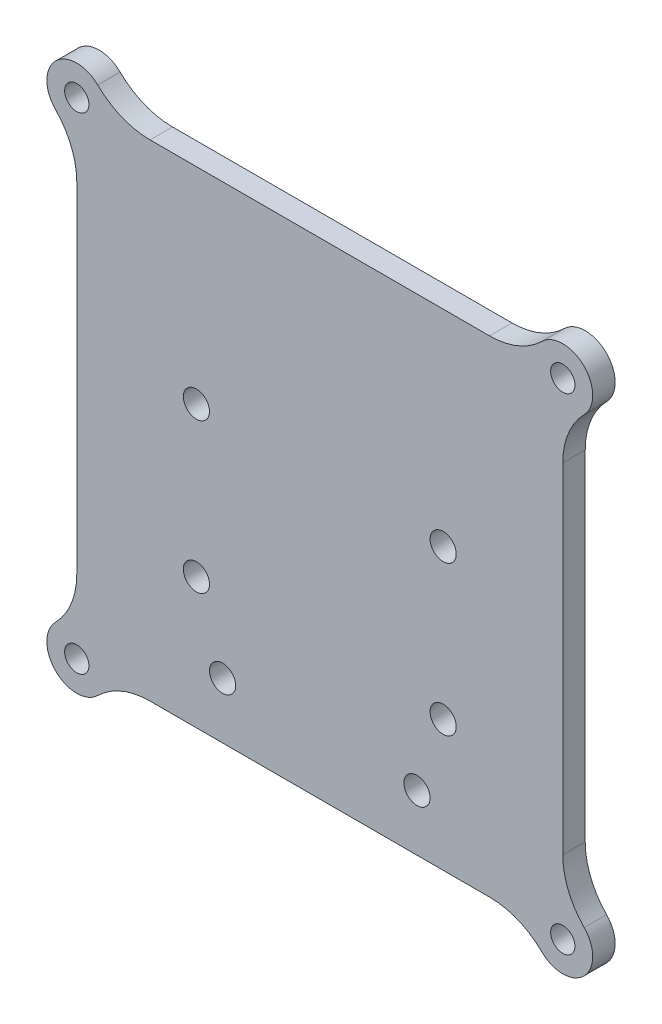
ISO-10303-21;
HEADER;
FILE_DESCRIPTION(('STEP AP214'),'2;1');
FILE_NAME('part.step','',(''),(''),'','','');
FILE_SCHEMA(('AUTOMOTIVE_DESIGN { 1 0 10303 214 1 1 1 1 }'));
ENDSEC;
DATA;
#1=APPLICATION_CONTEXT('core data for automotive mechanical design processes');
#2=APPLICATION_PROTOCOL_DEFINITION('international standard','automotive_design',2000,#1);
#3=PRODUCT_CONTEXT('',#1,'mechanical');
#4=PRODUCT('Part','Part','',(#3));
#5=PRODUCT_RELATED_PRODUCT_CATEGORY('part','',(#4));
#6=PRODUCT_DEFINITION_FORMATION('','',#4);
#7=PRODUCT_DEFINITION_CONTEXT('part definition',#1,'design');
#8=PRODUCT_DEFINITION('design','',#6,#7);
#9=PRODUCT_DEFINITION_SHAPE('','',#8);
#10=(LENGTH_UNIT() NAMED_UNIT(*) SI_UNIT(.MILLI.,.METRE.));
#11=(NAMED_UNIT(*) PLANE_ANGLE_UNIT() SI_UNIT($,.RADIAN.));
#12=(NAMED_UNIT(*) SI_UNIT($,.STERADIAN.) SOLID_ANGLE_UNIT());
#13=UNCERTAINTY_MEASURE_WITH_UNIT(LENGTH_MEASURE(1.E-05),#10,'distance_accuracy_value','');
#14=(GEOMETRIC_REPRESENTATION_CONTEXT(3) GLOBAL_UNCERTAINTY_ASSIGNED_CONTEXT((#13)) GLOBAL_UNIT_ASSIGNED_CONTEXT((#10,
#11,#12)) REPRESENTATION_CONTEXT('',''));
#15=CARTESIAN_POINT('',(0.,0.,0.));
#16=DIRECTION('',(0.,0.,1.));
#17=DIRECTION('',(1.,0.,0.));
#18=AXIS2_PLACEMENT_3D('',#15,#16,#17);
#19=CARTESIAN_POINT('',(-32.5,-32.5,3.));
#20=DIRECTION('',(0.,0.,-1.));
#21=DIRECTION('',(-1.,0.,0.));
#22=AXIS2_PLACEMENT_3D('',#19,#20,#21);
#23=CYLINDRICAL_SURFACE('',#22,4.00000000000001);
#24=CARTESIAN_POINT('',(-32.5,-32.5,0.));
#25=DIRECTION('',(0.,0.,1.));
#26=DIRECTION('',(1.,0.,0.));
#27=AXIS2_PLACEMENT_3D('',#24,#25,#26);
#28=CIRCLE('',#27,4.00000000000001);
#29=CARTESIAN_POINT('',(-35.3571428571429,-29.7005831511049,0.));
#30=VERTEX_POINT('',#29);
#31=CARTESIAN_POINT('',(-29.7005831511049,-35.3571428571429,0.));
#32=VERTEX_POINT('',#31);
#33=EDGE_CURVE('E177',#30,#32,#28,.T.);
#34=ORIENTED_EDGE('',*,*,#33,.T.);
#35=DIRECTION('',(0.,0.,-1.));
#36=VECTOR('',#35,1.);
#37=CARTESIAN_POINT('',(-29.7005831511049,-35.3571428571429,3.));
#38=LINE('',#37,#36);
#39=CARTESIAN_POINT('',(-29.7005831511049,-35.3571428571429,3.));
#40=VERTEX_POINT('',#39);
#41=EDGE_CURVE('E156',#32,#40,#38,.F.);
#42=ORIENTED_EDGE('',*,*,#41,.T.);
#43=CARTESIAN_POINT('',(-32.5,-32.5,3.));
#44=DIRECTION('',(0.,0.,1.));
#45=DIRECTION('',(1.,0.,0.));
#46=AXIS2_PLACEMENT_3D('',#43,#44,#45);
#47=CIRCLE('',#46,4.00000000000001);
#48=CARTESIAN_POINT('',(-35.3571428571429,-29.7005831511049,3.));
#49=VERTEX_POINT('',#48);
#50=EDGE_CURVE('E211',#49,#40,#47,.T.);
#51=ORIENTED_EDGE('',*,*,#50,.F.);
#52=DIRECTION('',(0.,0.,-1.));
#53=VECTOR('',#52,1.);
#54=CARTESIAN_POINT('',(-35.3571428571429,-29.7005831511049,3.));
#55=LINE('',#54,#53);
#56=EDGE_CURVE('E170',#49,#30,#55,.T.);
#57=ORIENTED_EDGE('',*,*,#56,.T.);
#58=EDGE_LOOP('',(#34,#42,#51,#57));
#59=FACE_BOUND('',#58,.T.);
#60=ADVANCED_FACE('F36',(#59),#23,.T.);
#61=CARTESIAN_POINT('',(0.,-32.5,3.));
#62=DIRECTION('',(0.,1.,0.));
#63=DIRECTION('',(0.,0.,1.));
#64=AXIS2_PLACEMENT_3D('',#61,#62,#63);
#65=PLANE('',#64);
#66=DIRECTION('',(1.,0.,0.));
#67=VECTOR('',#66,1.);
#68=CARTESIAN_POINT('',(0.,-32.5,3.));
#69=LINE('',#68,#67);
#70=CARTESIAN_POINT('',(-22.7020410288673,-32.5,3.));
#71=VERTEX_POINT('',#70);
#72=CARTESIAN_POINT('',(22.7020410288673,-32.5,3.));
#73=VERTEX_POINT('',#72);
#74=EDGE_CURVE('E169',#71,#73,#69,.T.);
#75=ORIENTED_EDGE('',*,*,#74,.F.);
#76=DIRECTION('',(0.,0.,1.));
#77=VECTOR('',#76,1.);
#78=CARTESIAN_POINT('',(-22.7020410288673,-32.5,0.));
#79=LINE('',#78,#77);
#80=CARTESIAN_POINT('',(-22.7020410288673,-32.5,0.));
#81=VERTEX_POINT('',#80);
#82=EDGE_CURVE('E155',#71,#81,#79,.F.);
#83=ORIENTED_EDGE('',*,*,#82,.T.);
#84=DIRECTION('',(1.,0.,0.));
#85=VECTOR('',#84,1.);
#86=CARTESIAN_POINT('',(0.,-32.5,0.));
#87=LINE('',#86,#85);
#88=CARTESIAN_POINT('',(22.7020410288673,-32.5,0.));
#89=VERTEX_POINT('',#88);
#90=EDGE_CURVE('E167',#81,#89,#87,.T.);
#91=ORIENTED_EDGE('',*,*,#90,.T.);
#92=DIRECTION('',(0.,0.,1.));
#93=VECTOR('',#92,1.);
#94=CARTESIAN_POINT('',(22.7020410288673,-32.5,3.));
#95=LINE('',#94,#93);
#96=EDGE_CURVE('E171',#89,#73,#95,.T.);
#97=ORIENTED_EDGE('',*,*,#96,.T.);
#98=EDGE_LOOP('',(#75,#83,#91,#97));
#99=FACE_BOUND('',#98,.T.);
#100=ADVANCED_FACE('F166',(#99),#65,.F.);
#101=CARTESIAN_POINT('',(32.5,-32.5,3.));
#102=DIRECTION('',(0.,0.,-1.));
#103=DIRECTION('',(-1.,0.,0.));
#104=AXIS2_PLACEMENT_3D('',#101,#102,#103);
#105=CYLINDRICAL_SURFACE('',#104,4.);
#106=CARTESIAN_POINT('',(32.5,-32.5,0.));
#107=DIRECTION('',(0.,0.,1.));
#108=DIRECTION('',(1.,0.,0.));
#109=AXIS2_PLACEMENT_3D('',#106,#107,#108);
#110=CIRCLE('',#109,4.);
#111=CARTESIAN_POINT('',(29.700583151105,-35.3571428571429,0.));
#112=VERTEX_POINT('',#111);
#113=CARTESIAN_POINT('',(35.3571428571429,-29.7005831511049,0.));
#114=VERTEX_POINT('',#113);
#115=EDGE_CURVE('E176',#112,#114,#110,.T.);
#116=ORIENTED_EDGE('',*,*,#115,.T.);
#117=DIRECTION('',(0.,0.,-1.));
#118=VECTOR('',#117,1.);
#119=CARTESIAN_POINT('',(35.3571428571429,-29.7005831511049,3.));
#120=LINE('',#119,#118);
#121=CARTESIAN_POINT('',(35.3571428571429,-29.7005831511049,3.));
#122=VERTEX_POINT('',#121);
#123=EDGE_CURVE('E53',#114,#122,#120,.F.);
#124=ORIENTED_EDGE('',*,*,#123,.T.);
#125=CARTESIAN_POINT('',(32.5,-32.5,3.));
#126=DIRECTION('',(0.,0.,1.));
#127=DIRECTION('',(1.,0.,0.));
#128=AXIS2_PLACEMENT_3D('',#125,#126,#127);
#129=CIRCLE('',#128,4.);
#130=CARTESIAN_POINT('',(29.700583151105,-35.3571428571429,3.));
#131=VERTEX_POINT('',#130);
#132=EDGE_CURVE('E311',#131,#122,#129,.T.);
#133=ORIENTED_EDGE('',*,*,#132,.F.);
#134=DIRECTION('',(0.,0.,-1.));
#135=VECTOR('',#134,1.);
#136=CARTESIAN_POINT('',(29.700583151105,-35.3571428571429,3.));
#137=LINE('',#136,#135);
#138=EDGE_CURVE('E242',#131,#112,#137,.T.);
#139=ORIENTED_EDGE('',*,*,#138,.T.);
#140=EDGE_LOOP('',(#116,#124,#133,#139));
#141=FACE_BOUND('',#140,.T.);
#142=ADVANCED_FACE('F362',(#141),#105,.T.);
#143=CARTESIAN_POINT('',(32.5,0.,3.));
#144=DIRECTION('',(-1.,0.,0.));
#145=DIRECTION('',(0.,0.,1.));
#146=AXIS2_PLACEMENT_3D('',#143,#144,#145);
#147=PLANE('',#146);
#148=DIRECTION('',(0.,1.,0.));
#149=VECTOR('',#148,1.);
#150=CARTESIAN_POINT('',(32.5,0.,0.));
#151=LINE('',#150,#149);
#152=CARTESIAN_POINT('',(32.5,-22.7020410288673,0.));
#153=VERTEX_POINT('',#152);
#154=CARTESIAN_POINT('',(32.5,22.7020410288673,0.));
#155=VERTEX_POINT('',#154);
#156=EDGE_CURVE('E179',#153,#155,#151,.T.);
#157=ORIENTED_EDGE('',*,*,#156,.T.);
#158=DIRECTION('',(0.,0.,1.));
#159=VECTOR('',#158,1.);
#160=CARTESIAN_POINT('',(32.5,22.7020410288673,3.));
#161=LINE('',#160,#159);
#162=CARTESIAN_POINT('',(32.5,22.7020410288673,3.));
#163=VERTEX_POINT('',#162);
#164=EDGE_CURVE('E240',#155,#163,#161,.T.);
#165=ORIENTED_EDGE('',*,*,#164,.T.);
#166=DIRECTION('',(0.,1.,0.));
#167=VECTOR('',#166,1.);
#168=CARTESIAN_POINT('',(32.5,0.,3.));
#169=LINE('',#168,#167);
#170=CARTESIAN_POINT('',(32.5,-22.7020410288673,3.));
#171=VERTEX_POINT('',#170);
#172=EDGE_CURVE('E313',#171,#163,#169,.T.);
#173=ORIENTED_EDGE('',*,*,#172,.F.);
#174=DIRECTION('',(0.,0.,1.));
#175=VECTOR('',#174,1.);
#176=CARTESIAN_POINT('',(32.5,-22.7020410288673,0.));
#177=LINE('',#176,#175);
#178=EDGE_CURVE('E237',#171,#153,#177,.F.);
#179=ORIENTED_EDGE('',*,*,#178,.T.);
#180=EDGE_LOOP('',(#157,#165,#173,#179));
#181=FACE_BOUND('',#180,.T.);
#182=ADVANCED_FACE('F402',(#181),#147,.F.);
#183=CARTESIAN_POINT('',(32.5,32.5,3.));
#184=DIRECTION('',(0.,0.,-1.));
#185=DIRECTION('',(-1.,0.,0.));
#186=AXIS2_PLACEMENT_3D('',#183,#184,#185);
#187=CYLINDRICAL_SURFACE('',#186,4.);
#188=CARTESIAN_POINT('',(32.5,32.5,0.));
#189=DIRECTION('',(0.,0.,1.));
#190=DIRECTION('',(1.,0.,0.));
#191=AXIS2_PLACEMENT_3D('',#188,#189,#190);
#192=CIRCLE('',#191,4.);
#193=CARTESIAN_POINT('',(35.3571428571429,29.7005831511049,0.));
#194=VERTEX_POINT('',#193);
#195=CARTESIAN_POINT('',(29.7005831511049,35.3571428571429,0.));
#196=VERTEX_POINT('',#195);
#197=EDGE_CURVE('E187',#194,#196,#192,.T.);
#198=ORIENTED_EDGE('',*,*,#197,.T.);
#199=DIRECTION('',(0.,0.,-1.));
#200=VECTOR('',#199,1.);
#201=CARTESIAN_POINT('',(29.7005831511049,35.3571428571429,3.));
#202=LINE('',#201,#200);
#203=CARTESIAN_POINT('',(29.7005831511049,35.3571428571429,3.));
#204=VERTEX_POINT('',#203);
#205=EDGE_CURVE('E235',#196,#204,#202,.F.);
#206=ORIENTED_EDGE('',*,*,#205,.T.);
#207=CARTESIAN_POINT('',(32.5,32.5,3.));
#208=DIRECTION('',(0.,0.,1.));
#209=DIRECTION('',(1.,0.,0.));
#210=AXIS2_PLACEMENT_3D('',#207,#208,#209);
#211=CIRCLE('',#210,4.);
#212=CARTESIAN_POINT('',(35.3571428571429,29.7005831511049,3.));
#213=VERTEX_POINT('',#212);
#214=EDGE_CURVE('E316',#213,#204,#211,.T.);
#215=ORIENTED_EDGE('',*,*,#214,.F.);
#216=DIRECTION('',(0.,0.,-1.));
#217=VECTOR('',#216,1.);
#218=CARTESIAN_POINT('',(35.3571428571429,29.7005831511049,3.));
#219=LINE('',#218,#217);
#220=EDGE_CURVE('E232',#213,#194,#219,.T.);
#221=ORIENTED_EDGE('',*,*,#220,.T.);
#222=EDGE_LOOP('',(#198,#206,#215,#221));
#223=FACE_BOUND('',#222,.T.);
#224=ADVANCED_FACE('F409',(#223),#187,.T.);
#225=CARTESIAN_POINT('',(0.,32.5,3.));
#226=DIRECTION('',(0.,1.,0.));
#227=DIRECTION('',(0.,0.,1.));
#228=AXIS2_PLACEMENT_3D('',#225,#226,#227);
#229=PLANE('',#228);
#230=DIRECTION('',(1.,0.,0.));
#231=VECTOR('',#230,1.);
#232=CARTESIAN_POINT('',(0.,32.5,0.));
#233=LINE('',#232,#231);
#234=CARTESIAN_POINT('',(-22.7020410288673,32.5,0.));
#235=VERTEX_POINT('',#234);
#236=CARTESIAN_POINT('',(22.7020410288673,32.5,0.));
#237=VERTEX_POINT('',#236);
#238=EDGE_CURVE('E190',#235,#237,#233,.T.);
#239=ORIENTED_EDGE('',*,*,#238,.F.);
#240=DIRECTION('',(0.,0.,-1.));
#241=VECTOR('',#240,1.);
#242=CARTESIAN_POINT('',(-22.7020410288673,32.5,3.));
#243=LINE('',#242,#241);
#244=CARTESIAN_POINT('',(-22.7020410288673,32.5,3.));
#245=VERTEX_POINT('',#244);
#246=EDGE_CURVE('E230',#235,#245,#243,.F.);
#247=ORIENTED_EDGE('',*,*,#246,.T.);
#248=DIRECTION('',(1.,0.,0.));
#249=VECTOR('',#248,1.);
#250=CARTESIAN_POINT('',(0.,32.5,3.));
#251=LINE('',#250,#249);
#252=CARTESIAN_POINT('',(22.7020410288673,32.5,3.));
#253=VERTEX_POINT('',#252);
#254=EDGE_CURVE('E319',#245,#253,#251,.T.);
#255=ORIENTED_EDGE('',*,*,#254,.T.);
#256=DIRECTION('',(0.,0.,-1.));
#257=VECTOR('',#256,1.);
#258=CARTESIAN_POINT('',(22.7020410288673,32.5,3.));
#259=LINE('',#258,#257);
#260=EDGE_CURVE('E227',#253,#237,#259,.T.);
#261=ORIENTED_EDGE('',*,*,#260,.T.);
#262=EDGE_LOOP('',(#239,#247,#255,#261));
#263=FACE_BOUND('',#262,.T.);
#264=ADVANCED_FACE('F417',(#263),#229,.T.);
#265=CARTESIAN_POINT('',(-32.5,32.5,3.));
#266=DIRECTION('',(0.,0.,-1.));
#267=DIRECTION('',(-1.,0.,0.));
#268=AXIS2_PLACEMENT_3D('',#265,#266,#267);
#269=CYLINDRICAL_SURFACE('',#268,4.);
#270=CARTESIAN_POINT('',(-32.5,32.5,3.));
#271=DIRECTION('',(0.,0.,1.));
#272=DIRECTION('',(1.,0.,0.));
#273=AXIS2_PLACEMENT_3D('',#270,#271,#272);
#274=CIRCLE('',#273,4.);
#275=CARTESIAN_POINT('',(-29.7005831511049,35.3571428571429,3.));
#276=VERTEX_POINT('',#275);
#277=CARTESIAN_POINT('',(-35.3571428571429,29.7005831511049,3.));
#278=VERTEX_POINT('',#277);
#279=EDGE_CURVE('E322',#276,#278,#274,.T.);
#280=ORIENTED_EDGE('',*,*,#279,.F.);
#281=DIRECTION('',(0.,0.,-1.));
#282=VECTOR('',#281,1.);
#283=CARTESIAN_POINT('',(-29.7005831511049,35.3571428571429,3.));
#284=LINE('',#283,#282);
#285=CARTESIAN_POINT('',(-29.7005831511049,35.3571428571429,0.));
#286=VERTEX_POINT('',#285);
#287=EDGE_CURVE('E224',#276,#286,#284,.T.);
#288=ORIENTED_EDGE('',*,*,#287,.T.);
#289=CARTESIAN_POINT('',(-32.5,32.5,0.));
#290=DIRECTION('',(0.,0.,1.));
#291=DIRECTION('',(1.,0.,0.));
#292=AXIS2_PLACEMENT_3D('',#289,#290,#291);
#293=CIRCLE('',#292,4.);
#294=CARTESIAN_POINT('',(-35.3571428571429,29.7005831511049,0.));
#295=VERTEX_POINT('',#294);
#296=EDGE_CURVE('E193',#286,#295,#293,.T.);
#297=ORIENTED_EDGE('',*,*,#296,.T.);
#298=DIRECTION('',(0.,0.,-1.));
#299=VECTOR('',#298,1.);
#300=CARTESIAN_POINT('',(-35.3571428571429,29.7005831511049,3.));
#301=LINE('',#300,#299);
#302=EDGE_CURVE('E222',#295,#278,#301,.F.);
#303=ORIENTED_EDGE('',*,*,#302,.T.);
#304=EDGE_LOOP('',(#280,#288,#297,#303));
#305=FACE_BOUND('',#304,.T.);
#306=ADVANCED_FACE('F423',(#305),#269,.T.);
#307=CARTESIAN_POINT('',(-32.5,-32.5,3.));
#308=DIRECTION('',(0.,0.,-1.));
#309=DIRECTION('',(-1.,0.,0.));
#310=AXIS2_PLACEMENT_3D('',#307,#308,#309);
#311=CYLINDRICAL_SURFACE('',#310,1.625);
#312=CARTESIAN_POINT('',(-32.5,-32.5,3.));
#313=DIRECTION('',(0.,0.,1.));
#314=DIRECTION('',(1.,0.,0.));
#315=AXIS2_PLACEMENT_3D('',#312,#313,#314);
#316=CIRCLE('',#315,1.625);
#317=CARTESIAN_POINT('',(-30.875,-32.5,3.));
#318=VERTEX_POINT('',#317);
#319=EDGE_CURVE('E334',#318,#318,#316,.T.);
#320=ORIENTED_EDGE('',*,*,#319,.T.);
#321=EDGE_LOOP('',(#320));
#322=FACE_BOUND('',#321,.T.);
#323=CARTESIAN_POINT('',(-32.5,-32.5,0.));
#324=DIRECTION('',(0.,0.,1.));
#325=DIRECTION('',(1.,0.,0.));
#326=AXIS2_PLACEMENT_3D('',#323,#324,#325);
#327=CIRCLE('',#326,1.625);
#328=CARTESIAN_POINT('',(-30.875,-32.5,0.));
#329=VERTEX_POINT('',#328);
#330=EDGE_CURVE('E205',#329,#329,#327,.T.);
#331=ORIENTED_EDGE('',*,*,#330,.F.);
#332=EDGE_LOOP('',(#331));
#333=FACE_BOUND('',#332,.T.);
#334=ADVANCED_FACE('F446',(#322,#333),#311,.F.);
#335=CARTESIAN_POINT('',(32.5,32.5,3.));
#336=DIRECTION('',(0.,0.,-1.));
#337=DIRECTION('',(-1.,0.,0.));
#338=AXIS2_PLACEMENT_3D('',#335,#336,#337);
#339=CYLINDRICAL_SURFACE('',#338,1.62500000000001);
#340=CARTESIAN_POINT('',(32.5,32.5,3.));
#341=DIRECTION('',(0.,0.,1.));
#342=DIRECTION('',(1.,0.,0.));
#343=AXIS2_PLACEMENT_3D('',#340,#341,#342);
#344=CIRCLE('',#343,1.62500000000001);
#345=CARTESIAN_POINT('',(34.125,32.5,3.));
#346=VERTEX_POINT('',#345);
#347=EDGE_CURVE('E331',#346,#346,#344,.T.);
#348=ORIENTED_EDGE('',*,*,#347,.T.);
#349=EDGE_LOOP('',(#348));
#350=FACE_BOUND('',#349,.T.);
#351=CARTESIAN_POINT('',(32.5,32.5,0.));
#352=DIRECTION('',(0.,0.,1.));
#353=DIRECTION('',(1.,0.,0.));
#354=AXIS2_PLACEMENT_3D('',#351,#352,#353);
#355=CIRCLE('',#354,1.62500000000001);
#356=CARTESIAN_POINT('',(34.125,32.5,0.));
#357=VERTEX_POINT('',#356);
#358=EDGE_CURVE('E202',#357,#357,#355,.T.);
#359=ORIENTED_EDGE('',*,*,#358,.F.);
#360=EDGE_LOOP('',(#359));
#361=FACE_BOUND('',#360,.T.);
#362=ADVANCED_FACE('F452',(#350,#361),#339,.F.);
#363=CARTESIAN_POINT('',(32.5,-32.5,3.));
#364=DIRECTION('',(0.,0.,-1.));
#365=DIRECTION('',(-1.,0.,0.));
#366=AXIS2_PLACEMENT_3D('',#363,#364,#365);
#367=CYLINDRICAL_SURFACE('',#366,1.625);
#368=CARTESIAN_POINT('',(32.5,-32.5,3.));
#369=DIRECTION('',(0.,0.,1.));
#370=DIRECTION('',(1.,0.,0.));
#371=AXIS2_PLACEMENT_3D('',#368,#369,#370);
#372=CIRCLE('',#371,1.625);
#373=CARTESIAN_POINT('',(34.125,-32.5,3.));
#374=VERTEX_POINT('',#373);
#375=EDGE_CURVE('E328',#374,#374,#372,.T.);
#376=ORIENTED_EDGE('',*,*,#375,.T.);
#377=EDGE_LOOP('',(#376));
#378=FACE_BOUND('',#377,.T.);
#379=CARTESIAN_POINT('',(32.5,-32.5,0.));
#380=DIRECTION('',(0.,0.,1.));
#381=DIRECTION('',(1.,0.,0.));
#382=AXIS2_PLACEMENT_3D('',#379,#380,#381);
#383=CIRCLE('',#382,1.625);
#384=CARTESIAN_POINT('',(34.125,-32.5,0.));
#385=VERTEX_POINT('',#384);
#386=EDGE_CURVE('E199',#385,#385,#383,.T.);
#387=ORIENTED_EDGE('',*,*,#386,.F.);
#388=EDGE_LOOP('',(#387));
#389=FACE_BOUND('',#388,.T.);
#390=ADVANCED_FACE('F449',(#378,#389),#367,.F.);
#391=CARTESIAN_POINT('',(-32.5,0.,3.));
#392=DIRECTION('',(-1.,0.,0.));
#393=DIRECTION('',(0.,0.,1.));
#394=AXIS2_PLACEMENT_3D('',#391,#392,#393);
#395=PLANE('',#394);
#396=DIRECTION('',(0.,1.,0.));
#397=VECTOR('',#396,1.);
#398=CARTESIAN_POINT('',(-32.5,0.,0.));
#399=LINE('',#398,#397);
#400=CARTESIAN_POINT('',(-32.5,-22.7020410288673,0.));
#401=VERTEX_POINT('',#400);
#402=CARTESIAN_POINT('',(-32.5,22.7020410288673,0.));
#403=VERTEX_POINT('',#402);
#404=EDGE_CURVE('E196',#401,#403,#399,.T.);
#405=ORIENTED_EDGE('',*,*,#404,.F.);
#406=DIRECTION('',(0.,0.,-1.));
#407=VECTOR('',#406,1.);
#408=CARTESIAN_POINT('',(-32.5,-22.7020410288673,3.));
#409=LINE('',#408,#407);
#410=CARTESIAN_POINT('',(-32.5,-22.7020410288673,3.));
#411=VERTEX_POINT('',#410);
#412=EDGE_CURVE('E220',#401,#411,#409,.F.);
#413=ORIENTED_EDGE('',*,*,#412,.T.);
#414=DIRECTION('',(0.,1.,0.));
#415=VECTOR('',#414,1.);
#416=CARTESIAN_POINT('',(-32.5,0.,3.));
#417=LINE('',#416,#415);
#418=CARTESIAN_POINT('',(-32.5,22.7020410288673,3.));
#419=VERTEX_POINT('',#418);
#420=EDGE_CURVE('E325',#411,#419,#417,.T.);
#421=ORIENTED_EDGE('',*,*,#420,.T.);
#422=DIRECTION('',(0.,0.,-1.));
#423=VECTOR('',#422,1.);
#424=CARTESIAN_POINT('',(-32.5,22.7020410288673,3.));
#425=LINE('',#424,#423);
#426=EDGE_CURVE('E217',#419,#403,#425,.T.);
#427=ORIENTED_EDGE('',*,*,#426,.T.);
#428=EDGE_LOOP('',(#405,#413,#421,#427));
#429=FACE_BOUND('',#428,.T.);
#430=ADVANCED_FACE('F352',(#429),#395,.T.);
#431=CARTESIAN_POINT('',(-32.5,32.5,3.));
#432=DIRECTION('',(0.,0.,-1.));
#433=DIRECTION('',(-1.,0.,0.));
#434=AXIS2_PLACEMENT_3D('',#431,#432,#433);
#435=CYLINDRICAL_SURFACE('',#434,1.625);
#436=CARTESIAN_POINT('',(-32.5,32.5,3.));
#437=DIRECTION('',(0.,0.,1.));
#438=DIRECTION('',(1.,0.,0.));
#439=AXIS2_PLACEMENT_3D('',#436,#437,#438);
#440=CIRCLE('',#439,1.625);
#441=CARTESIAN_POINT('',(-30.875,32.5,3.));
#442=VERTEX_POINT('',#441);
#443=EDGE_CURVE('E212',#442,#442,#440,.T.);
#444=ORIENTED_EDGE('',*,*,#443,.T.);
#445=EDGE_LOOP('',(#444));
#446=FACE_BOUND('',#445,.T.);
#447=CARTESIAN_POINT('',(-32.5,32.5,0.));
#448=DIRECTION('',(0.,0.,1.));
#449=DIRECTION('',(1.,0.,0.));
#450=AXIS2_PLACEMENT_3D('',#447,#448,#449);
#451=CIRCLE('',#450,1.625);
#452=CARTESIAN_POINT('',(-30.875,32.5,0.));
#453=VERTEX_POINT('',#452);
#454=EDGE_CURVE('E208',#453,#453,#451,.T.);
#455=ORIENTED_EDGE('',*,*,#454,.F.);
#456=EDGE_LOOP('',(#455));
#457=FACE_BOUND('',#456,.T.);
#458=ADVANCED_FACE('F339',(#446,#457),#435,.F.);
#459=CARTESIAN_POINT('',(0.,0.,3.));
#460=DIRECTION('',(0.,0.,1.));
#461=DIRECTION('',(1.,0.,0.));
#462=AXIS2_PLACEMENT_3D('',#459,#460,#461);
#463=PLANE('',#462);
#464=CARTESIAN_POINT('',(-16.5,5.,3.));
#465=DIRECTION('',(0.,0.,1.));
#466=DIRECTION('',(1.,0.,0.));
#467=AXIS2_PLACEMENT_3D('',#464,#465,#466);
#468=CIRCLE('',#467,1.75);
#469=CARTESIAN_POINT('',(-14.75,5.,3.));
#470=VERTEX_POINT('',#469);
#471=EDGE_CURVE('E287',#470,#470,#468,.T.);
#472=ORIENTED_EDGE('',*,*,#471,.F.);
#473=EDGE_LOOP('',(#472));
#474=FACE_BOUND('',#473,.T.);
#475=CARTESIAN_POINT('',(16.5,5.,3.));
#476=DIRECTION('',(0.,0.,1.));
#477=DIRECTION('',(-1.,0.,0.));
#478=AXIS2_PLACEMENT_3D('',#475,#476,#477);
#479=CIRCLE('',#478,1.75);
#480=CARTESIAN_POINT('',(14.75,5.,3.));
#481=VERTEX_POINT('',#480);
#482=EDGE_CURVE('E293',#481,#481,#479,.T.);
#483=ORIENTED_EDGE('',*,*,#482,.F.);
#484=EDGE_LOOP('',(#483));
#485=FACE_BOUND('',#484,.T.);
#486=CARTESIAN_POINT('',(-16.5,-15.,3.));
#487=DIRECTION('',(0.,0.,1.));
#488=DIRECTION('',(1.,0.,0.));
#489=AXIS2_PLACEMENT_3D('',#486,#487,#488);
#490=CIRCLE('',#489,1.75);
#491=CARTESIAN_POINT('',(-14.75,-15.,3.));
#492=VERTEX_POINT('',#491);
#493=EDGE_CURVE('E282',#492,#492,#490,.T.);
#494=ORIENTED_EDGE('',*,*,#493,.F.);
#495=EDGE_LOOP('',(#494));
#496=FACE_BOUND('',#495,.T.);
#497=CARTESIAN_POINT('',(16.5,-15.,3.));
#498=DIRECTION('',(0.,0.,1.));
#499=DIRECTION('',(-1.,0.,0.));
#500=AXIS2_PLACEMENT_3D('',#497,#498,#499);
#501=CIRCLE('',#500,1.75);
#502=CARTESIAN_POINT('',(14.75,-15.,3.));
#503=VERTEX_POINT('',#502);
#504=EDGE_CURVE('E291',#503,#503,#501,.T.);
#505=ORIENTED_EDGE('',*,*,#504,.F.);
#506=EDGE_LOOP('',(#505));
#507=FACE_BOUND('',#506,.T.);
#508=CARTESIAN_POINT('',(-13.,-25.,3.));
#509=DIRECTION('',(0.,0.,1.));
#510=DIRECTION('',(1.,0.,0.));
#511=AXIS2_PLACEMENT_3D('',#508,#509,#510);
#512=CIRCLE('',#511,1.75);
#513=CARTESIAN_POINT('',(-11.25,-25.,3.));
#514=VERTEX_POINT('',#513);
#515=EDGE_CURVE('E275',#514,#514,#512,.T.);
#516=ORIENTED_EDGE('',*,*,#515,.F.);
#517=EDGE_LOOP('',(#516));
#518=FACE_BOUND('',#517,.T.);
#519=CARTESIAN_POINT('',(13.,-25.,3.));
#520=DIRECTION('',(0.,0.,1.));
#521=DIRECTION('',(-1.,0.,0.));
#522=AXIS2_PLACEMENT_3D('',#519,#520,#521);
#523=CIRCLE('',#522,1.75);
#524=CARTESIAN_POINT('',(11.25,-25.,3.));
#525=VERTEX_POINT('',#524);
#526=EDGE_CURVE('E284',#525,#525,#523,.T.);
#527=ORIENTED_EDGE('',*,*,#526,.F.);
#528=EDGE_LOOP('',(#527));
#529=FACE_BOUND('',#528,.T.);
#530=ORIENTED_EDGE('',*,*,#420,.F.);
#531=CARTESIAN_POINT('',(-42.5,-22.7020410288673,3.));
#532=DIRECTION('',(0.,0.,1.));
#533=DIRECTION('',(1.,0.,0.));
#534=AXIS2_PLACEMENT_3D('',#531,#532,#533);
#535=CIRCLE('',#534,10.);
#536=EDGE_CURVE('E249',#411,#49,#535,.F.);
#537=ORIENTED_EDGE('',*,*,#536,.T.);
#538=ORIENTED_EDGE('',*,*,#50,.T.);
#539=CARTESIAN_POINT('',(-22.7020410288673,-42.5,3.));
#540=DIRECTION('',(0.,0.,1.));
#541=DIRECTION('',(1.,0.,0.));
#542=AXIS2_PLACEMENT_3D('',#539,#540,#541);
#543=CIRCLE('',#542,10.);
#544=EDGE_CURVE('E161',#40,#71,#543,.F.);
#545=ORIENTED_EDGE('',*,*,#544,.T.);
#546=ORIENTED_EDGE('',*,*,#74,.T.);
#547=CARTESIAN_POINT('',(22.7020410288673,-42.5,3.));
#548=DIRECTION('',(0.,0.,1.));
#549=DIRECTION('',(1.,0.,0.));
#550=AXIS2_PLACEMENT_3D('',#547,#548,#549);
#551=CIRCLE('',#550,10.);
#552=EDGE_CURVE('E11',#73,#131,#551,.F.);
#553=ORIENTED_EDGE('',*,*,#552,.T.);
#554=ORIENTED_EDGE('',*,*,#132,.T.);
#555=CARTESIAN_POINT('',(42.5,-22.7020410288673,3.));
#556=DIRECTION('',(0.,0.,1.));
#557=DIRECTION('',(1.,0.,0.));
#558=AXIS2_PLACEMENT_3D('',#555,#556,#557);
#559=CIRCLE('',#558,10.);
#560=EDGE_CURVE('E269',#122,#171,#559,.F.);
#561=ORIENTED_EDGE('',*,*,#560,.T.);
#562=ORIENTED_EDGE('',*,*,#172,.T.);
#563=CARTESIAN_POINT('',(42.5,22.7020410288673,3.));
#564=DIRECTION('',(0.,0.,1.));
#565=DIRECTION('',(1.,0.,0.));
#566=AXIS2_PLACEMENT_3D('',#563,#564,#565);
#567=CIRCLE('',#566,10.);
#568=EDGE_CURVE('E265',#163,#213,#567,.F.);
#569=ORIENTED_EDGE('',*,*,#568,.T.);
#570=ORIENTED_EDGE('',*,*,#214,.T.);
#571=CARTESIAN_POINT('',(22.7020410288673,42.5,3.));
#572=DIRECTION('',(0.,0.,1.));
#573=DIRECTION('',(1.,0.,0.));
#574=AXIS2_PLACEMENT_3D('',#571,#572,#573);
#575=CIRCLE('',#574,10.);
#576=EDGE_CURVE('E261',#204,#253,#575,.F.);
#577=ORIENTED_EDGE('',*,*,#576,.T.);
#578=ORIENTED_EDGE('',*,*,#254,.F.);
#579=CARTESIAN_POINT('',(-22.7020410288673,42.5,3.));
#580=DIRECTION('',(0.,0.,1.));
#581=DIRECTION('',(1.,0.,0.));
#582=AXIS2_PLACEMENT_3D('',#579,#580,#581);
#583=CIRCLE('',#582,10.);
#584=EDGE_CURVE('E253',#245,#276,#583,.F.);
#585=ORIENTED_EDGE('',*,*,#584,.T.);
#586=ORIENTED_EDGE('',*,*,#279,.T.);
#587=CARTESIAN_POINT('',(-42.5,22.7020410288673,3.));
#588=DIRECTION('',(0.,0.,1.));
#589=DIRECTION('',(1.,0.,0.));
#590=AXIS2_PLACEMENT_3D('',#587,#588,#589);
#591=CIRCLE('',#590,10.);
#592=EDGE_CURVE('E257',#278,#419,#591,.F.);
#593=ORIENTED_EDGE('',*,*,#592,.T.);
#594=EDGE_LOOP('',(#530,#537,#538,#545,#546,#553,#554,#561,#562,#569,#570,#577,#578,#585,#586,#593));
#595=FACE_BOUND('',#594,.T.);
#596=ORIENTED_EDGE('',*,*,#375,.F.);
#597=EDGE_LOOP('',(#596));
#598=FACE_BOUND('',#597,.T.);
#599=ORIENTED_EDGE('',*,*,#347,.F.);
#600=EDGE_LOOP('',(#599));
#601=FACE_BOUND('',#600,.T.);
#602=ORIENTED_EDGE('',*,*,#319,.F.);
#603=EDGE_LOOP('',(#602));
#604=FACE_BOUND('',#603,.T.);
#605=ORIENTED_EDGE('',*,*,#443,.F.);
#606=EDGE_LOOP('',(#605));
#607=FACE_BOUND('',#606,.T.);
#608=ADVANCED_FACE('F342',(#474,#485,#496,#507,#518,#529,#595,#598,#601,#604,#607),#463,.T.);
#609=CARTESIAN_POINT('',(0.,0.,0.));
#610=DIRECTION('',(0.,0.,1.));
#611=DIRECTION('',(1.,0.,0.));
#612=AXIS2_PLACEMENT_3D('',#609,#610,#611);
#613=PLANE('',#612);
#614=CARTESIAN_POINT('',(-16.5,5.,0.));
#615=DIRECTION('',(0.,0.,1.));
#616=DIRECTION('',(1.,0.,0.));
#617=AXIS2_PLACEMENT_3D('',#614,#615,#616);
#618=CIRCLE('',#617,1.75);
#619=CARTESIAN_POINT('',(-14.75,5.,0.));
#620=VERTEX_POINT('',#619);
#621=EDGE_CURVE('E40',#620,#620,#618,.T.);
#622=ORIENTED_EDGE('',*,*,#621,.T.);
#623=EDGE_LOOP('',(#622));
#624=FACE_BOUND('',#623,.T.);
#625=CARTESIAN_POINT('',(16.5,5.,0.));
#626=DIRECTION('',(0.,0.,1.));
#627=DIRECTION('',(1.,0.,0.));
#628=AXIS2_PLACEMENT_3D('',#625,#626,#627);
#629=CIRCLE('',#628,1.75);
#630=CARTESIAN_POINT('',(18.25,5.,0.));
#631=VERTEX_POINT('',#630);
#632=EDGE_CURVE('E285',#631,#631,#629,.T.);
#633=ORIENTED_EDGE('',*,*,#632,.T.);
#634=EDGE_LOOP('',(#633));
#635=FACE_BOUND('',#634,.T.);
#636=CARTESIAN_POINT('',(-16.5,-15.,0.));
#637=DIRECTION('',(0.,0.,1.));
#638=DIRECTION('',(1.,0.,0.));
#639=AXIS2_PLACEMENT_3D('',#636,#637,#638);
#640=CIRCLE('',#639,1.75);
#641=CARTESIAN_POINT('',(-14.75,-15.,0.));
#642=VERTEX_POINT('',#641);
#643=EDGE_CURVE('E281',#642,#642,#640,.T.);
#644=ORIENTED_EDGE('',*,*,#643,.T.);
#645=EDGE_LOOP('',(#644));
#646=FACE_BOUND('',#645,.T.);
#647=CARTESIAN_POINT('',(16.5,-15.,0.));
#648=DIRECTION('',(0.,0.,1.));
#649=DIRECTION('',(1.,0.,0.));
#650=AXIS2_PLACEMENT_3D('',#647,#648,#649);
#651=CIRCLE('',#650,1.75);
#652=CARTESIAN_POINT('',(18.25,-15.,0.));
#653=VERTEX_POINT('',#652);
#654=EDGE_CURVE('E278',#653,#653,#651,.T.);
#655=ORIENTED_EDGE('',*,*,#654,.T.);
#656=EDGE_LOOP('',(#655));
#657=FACE_BOUND('',#656,.T.);
#658=CARTESIAN_POINT('',(-13.,-25.,0.));
#659=DIRECTION('',(0.,0.,1.));
#660=DIRECTION('',(1.,0.,0.));
#661=AXIS2_PLACEMENT_3D('',#658,#659,#660);
#662=CIRCLE('',#661,1.75);
#663=CARTESIAN_POINT('',(-11.25,-25.,0.));
#664=VERTEX_POINT('',#663);
#665=EDGE_CURVE('E181',#664,#664,#662,.T.);
#666=ORIENTED_EDGE('',*,*,#665,.T.);
#667=EDGE_LOOP('',(#666));
#668=FACE_BOUND('',#667,.T.);
#669=CARTESIAN_POINT('',(13.,-25.,0.));
#670=DIRECTION('',(0.,0.,1.));
#671=DIRECTION('',(1.,0.,0.));
#672=AXIS2_PLACEMENT_3D('',#669,#670,#671);
#673=CIRCLE('',#672,1.75);
#674=CARTESIAN_POINT('',(14.75,-25.,0.));
#675=VERTEX_POINT('',#674);
#676=EDGE_CURVE('E272',#675,#675,#673,.T.);
#677=ORIENTED_EDGE('',*,*,#676,.T.);
#678=EDGE_LOOP('',(#677));
#679=FACE_BOUND('',#678,.T.);
#680=ORIENTED_EDGE('',*,*,#33,.F.);
#681=CARTESIAN_POINT('',(-42.5,-22.7020410288673,0.));
#682=DIRECTION('',(0.,0.,1.));
#683=DIRECTION('',(1.,0.,0.));
#684=AXIS2_PLACEMENT_3D('',#681,#682,#683);
#685=CIRCLE('',#684,10.);
#686=EDGE_CURVE('E247',#30,#401,#685,.T.);
#687=ORIENTED_EDGE('',*,*,#686,.T.);
#688=ORIENTED_EDGE('',*,*,#404,.T.);
#689=CARTESIAN_POINT('',(-42.5,22.7020410288673,0.));
#690=DIRECTION('',(0.,0.,1.));
#691=DIRECTION('',(1.,0.,0.));
#692=AXIS2_PLACEMENT_3D('',#689,#690,#691);
#693=CIRCLE('',#692,10.);
#694=EDGE_CURVE('E255',#403,#295,#693,.T.);
#695=ORIENTED_EDGE('',*,*,#694,.T.);
#696=ORIENTED_EDGE('',*,*,#296,.F.);
#697=CARTESIAN_POINT('',(-22.7020410288673,42.5,0.));
#698=DIRECTION('',(0.,0.,1.));
#699=DIRECTION('',(1.,0.,0.));
#700=AXIS2_PLACEMENT_3D('',#697,#698,#699);
#701=CIRCLE('',#700,10.);
#702=EDGE_CURVE('E251',#286,#235,#701,.T.);
#703=ORIENTED_EDGE('',*,*,#702,.T.);
#704=ORIENTED_EDGE('',*,*,#238,.T.);
#705=CARTESIAN_POINT('',(22.7020410288673,42.5,0.));
#706=DIRECTION('',(0.,0.,1.));
#707=DIRECTION('',(1.,0.,0.));
#708=AXIS2_PLACEMENT_3D('',#705,#706,#707);
#709=CIRCLE('',#708,10.);
#710=EDGE_CURVE('E259',#237,#196,#709,.T.);
#711=ORIENTED_EDGE('',*,*,#710,.T.);
#712=ORIENTED_EDGE('',*,*,#197,.F.);
#713=CARTESIAN_POINT('',(42.5,22.7020410288673,0.));
#714=DIRECTION('',(0.,0.,1.));
#715=DIRECTION('',(1.,0.,0.));
#716=AXIS2_PLACEMENT_3D('',#713,#714,#715);
#717=CIRCLE('',#716,10.);
#718=EDGE_CURVE('E263',#194,#155,#717,.T.);
#719=ORIENTED_EDGE('',*,*,#718,.T.);
#720=ORIENTED_EDGE('',*,*,#156,.F.);
#721=CARTESIAN_POINT('',(42.5,-22.7020410288673,0.));
#722=DIRECTION('',(0.,0.,1.));
#723=DIRECTION('',(1.,0.,0.));
#724=AXIS2_PLACEMENT_3D('',#721,#722,#723);
#725=CIRCLE('',#724,10.);
#726=EDGE_CURVE('E267',#153,#114,#725,.T.);
#727=ORIENTED_EDGE('',*,*,#726,.T.);
#728=ORIENTED_EDGE('',*,*,#115,.F.);
#729=CARTESIAN_POINT('',(22.7020410288673,-42.5,0.));
#730=DIRECTION('',(0.,0.,1.));
#731=DIRECTION('',(1.,0.,0.));
#732=AXIS2_PLACEMENT_3D('',#729,#730,#731);
#733=CIRCLE('',#732,10.);
#734=EDGE_CURVE('E45',#112,#89,#733,.T.);
#735=ORIENTED_EDGE('',*,*,#734,.T.);
#736=ORIENTED_EDGE('',*,*,#90,.F.);
#737=CARTESIAN_POINT('',(-22.7020410288673,-42.5,0.));
#738=DIRECTION('',(0.,0.,1.));
#739=DIRECTION('',(1.,0.,0.));
#740=AXIS2_PLACEMENT_3D('',#737,#738,#739);
#741=CIRCLE('',#740,10.);
#742=EDGE_CURVE('E151',#81,#32,#741,.T.);
#743=ORIENTED_EDGE('',*,*,#742,.T.);
#744=EDGE_LOOP('',(#680,#687,#688,#695,#696,#703,#704,#711,#712,#719,#720,#727,#728,#735,#736,#743));
#745=FACE_BOUND('',#744,.T.);
#746=ORIENTED_EDGE('',*,*,#386,.T.);
#747=EDGE_LOOP('',(#746));
#748=FACE_BOUND('',#747,.T.);
#749=ORIENTED_EDGE('',*,*,#358,.T.);
#750=EDGE_LOOP('',(#749));
#751=FACE_BOUND('',#750,.T.);
#752=ORIENTED_EDGE('',*,*,#330,.T.);
#753=EDGE_LOOP('',(#752));
#754=FACE_BOUND('',#753,.T.);
#755=ORIENTED_EDGE('',*,*,#454,.T.);
#756=EDGE_LOOP('',(#755));
#757=FACE_BOUND('',#756,.T.);
#758=ADVANCED_FACE('F173',(#624,#635,#646,#657,#668,#679,#745,#748,#751,#754,#757),#613,.F.);
#759=CARTESIAN_POINT('',(-22.7020410288673,-42.5,3.));
#760=DIRECTION('',(0.,0.,-1.));
#761=DIRECTION('',(-1.,0.,0.));
#762=AXIS2_PLACEMENT_3D('',#759,#760,#761);
#763=CYLINDRICAL_SURFACE('',#762,10.);
#764=ORIENTED_EDGE('',*,*,#544,.F.);
#765=ORIENTED_EDGE('',*,*,#41,.F.);
#766=ORIENTED_EDGE('',*,*,#742,.F.);
#767=ORIENTED_EDGE('',*,*,#82,.F.);
#768=EDGE_LOOP('',(#764,#765,#766,#767));
#769=FACE_BOUND('',#768,.T.);
#770=ADVANCED_FACE('F154',(#769),#763,.F.);
#771=CARTESIAN_POINT('',(-42.5,-22.7020410288673,3.));
#772=DIRECTION('',(0.,0.,-1.));
#773=DIRECTION('',(-1.,0.,0.));
#774=AXIS2_PLACEMENT_3D('',#771,#772,#773);
#775=CYLINDRICAL_SURFACE('',#774,10.);
#776=ORIENTED_EDGE('',*,*,#536,.F.);
#777=ORIENTED_EDGE('',*,*,#412,.F.);
#778=ORIENTED_EDGE('',*,*,#686,.F.);
#779=ORIENTED_EDGE('',*,*,#56,.F.);
#780=EDGE_LOOP('',(#776,#777,#778,#779));
#781=FACE_BOUND('',#780,.T.);
#782=ADVANCED_FACE('F368',(#781),#775,.F.);
#783=CARTESIAN_POINT('',(-22.7020410288673,42.5,3.));
#784=DIRECTION('',(0.,0.,-1.));
#785=DIRECTION('',(-1.,0.,0.));
#786=AXIS2_PLACEMENT_3D('',#783,#784,#785);
#787=CYLINDRICAL_SURFACE('',#786,10.);
#788=ORIENTED_EDGE('',*,*,#584,.F.);
#789=ORIENTED_EDGE('',*,*,#246,.F.);
#790=ORIENTED_EDGE('',*,*,#702,.F.);
#791=ORIENTED_EDGE('',*,*,#287,.F.);
#792=EDGE_LOOP('',(#788,#789,#790,#791));
#793=FACE_BOUND('',#792,.T.);
#794=ADVANCED_FACE('F371',(#793),#787,.F.);
#795=CARTESIAN_POINT('',(-42.5,22.7020410288673,3.));
#796=DIRECTION('',(0.,0.,-1.));
#797=DIRECTION('',(-1.,0.,0.));
#798=AXIS2_PLACEMENT_3D('',#795,#796,#797);
#799=CYLINDRICAL_SURFACE('',#798,10.);
#800=ORIENTED_EDGE('',*,*,#592,.F.);
#801=ORIENTED_EDGE('',*,*,#302,.F.);
#802=ORIENTED_EDGE('',*,*,#694,.F.);
#803=ORIENTED_EDGE('',*,*,#426,.F.);
#804=EDGE_LOOP('',(#800,#801,#802,#803));
#805=FACE_BOUND('',#804,.T.);
#806=ADVANCED_FACE('F375',(#805),#799,.F.);
#807=CARTESIAN_POINT('',(22.7020410288673,42.5,3.));
#808=DIRECTION('',(0.,0.,-1.));
#809=DIRECTION('',(-1.,0.,0.));
#810=AXIS2_PLACEMENT_3D('',#807,#808,#809);
#811=CYLINDRICAL_SURFACE('',#810,10.);
#812=ORIENTED_EDGE('',*,*,#576,.F.);
#813=ORIENTED_EDGE('',*,*,#205,.F.);
#814=ORIENTED_EDGE('',*,*,#710,.F.);
#815=ORIENTED_EDGE('',*,*,#260,.F.);
#816=EDGE_LOOP('',(#812,#813,#814,#815));
#817=FACE_BOUND('',#816,.T.);
#818=ADVANCED_FACE('F379',(#817),#811,.F.);
#819=CARTESIAN_POINT('',(42.5,22.7020410288673,3.));
#820=DIRECTION('',(0.,0.,-1.));
#821=DIRECTION('',(-1.,0.,0.));
#822=AXIS2_PLACEMENT_3D('',#819,#820,#821);
#823=CYLINDRICAL_SURFACE('',#822,10.);
#824=ORIENTED_EDGE('',*,*,#568,.F.);
#825=ORIENTED_EDGE('',*,*,#164,.F.);
#826=ORIENTED_EDGE('',*,*,#718,.F.);
#827=ORIENTED_EDGE('',*,*,#220,.F.);
#828=EDGE_LOOP('',(#824,#825,#826,#827));
#829=FACE_BOUND('',#828,.T.);
#830=ADVANCED_FACE('F383',(#829),#823,.F.);
#831=CARTESIAN_POINT('',(42.5,-22.7020410288673,3.));
#832=DIRECTION('',(0.,0.,-1.));
#833=DIRECTION('',(-1.,0.,0.));
#834=AXIS2_PLACEMENT_3D('',#831,#832,#833);
#835=CYLINDRICAL_SURFACE('',#834,10.);
#836=ORIENTED_EDGE('',*,*,#560,.F.);
#837=ORIENTED_EDGE('',*,*,#123,.F.);
#838=ORIENTED_EDGE('',*,*,#726,.F.);
#839=ORIENTED_EDGE('',*,*,#178,.F.);
#840=EDGE_LOOP('',(#836,#837,#838,#839));
#841=FACE_BOUND('',#840,.T.);
#842=ADVANCED_FACE('F386',(#841),#835,.F.);
#843=CARTESIAN_POINT('',(22.7020410288673,-42.5,3.));
#844=DIRECTION('',(0.,0.,-1.));
#845=DIRECTION('',(-1.,0.,0.));
#846=AXIS2_PLACEMENT_3D('',#843,#844,#845);
#847=CYLINDRICAL_SURFACE('',#846,10.);
#848=ORIENTED_EDGE('',*,*,#552,.F.);
#849=ORIENTED_EDGE('',*,*,#96,.F.);
#850=ORIENTED_EDGE('',*,*,#734,.F.);
#851=ORIENTED_EDGE('',*,*,#138,.F.);
#852=EDGE_LOOP('',(#848,#849,#850,#851));
#853=FACE_BOUND('',#852,.T.);
#854=ADVANCED_FACE('F38',(#853),#847,.F.);
#855=CARTESIAN_POINT('',(13.,-25.,-7.));
#856=DIRECTION('',(0.,0.,1.));
#857=DIRECTION('',(1.,0.,0.));
#858=AXIS2_PLACEMENT_3D('',#855,#856,#857);
#859=CYLINDRICAL_SURFACE('',#858,1.75);
#860=ORIENTED_EDGE('',*,*,#526,.T.);
#861=EDGE_LOOP('',(#860));
#862=FACE_BOUND('',#861,.T.);
#863=ORIENTED_EDGE('',*,*,#676,.F.);
#864=EDGE_LOOP('',(#863));
#865=FACE_BOUND('',#864,.T.);
#866=ADVANCED_FACE('F393',(#862,#865),#859,.F.);
#867=CARTESIAN_POINT('',(-13.,-25.,-7.));
#868=DIRECTION('',(0.,0.,1.));
#869=DIRECTION('',(1.,0.,0.));
#870=AXIS2_PLACEMENT_3D('',#867,#868,#869);
#871=CYLINDRICAL_SURFACE('',#870,1.75);
#872=ORIENTED_EDGE('',*,*,#515,.T.);
#873=EDGE_LOOP('',(#872));
#874=FACE_BOUND('',#873,.T.);
#875=ORIENTED_EDGE('',*,*,#665,.F.);
#876=EDGE_LOOP('',(#875));
#877=FACE_BOUND('',#876,.T.);
#878=ADVANCED_FACE('F614',(#874,#877),#871,.F.);
#879=CARTESIAN_POINT('',(16.5,-15.,-7.));
#880=DIRECTION('',(0.,0.,1.));
#881=DIRECTION('',(1.,0.,0.));
#882=AXIS2_PLACEMENT_3D('',#879,#880,#881);
#883=CYLINDRICAL_SURFACE('',#882,1.75);
#884=ORIENTED_EDGE('',*,*,#504,.T.);
#885=EDGE_LOOP('',(#884));
#886=FACE_BOUND('',#885,.T.);
#887=ORIENTED_EDGE('',*,*,#654,.F.);
#888=EDGE_LOOP('',(#887));
#889=FACE_BOUND('',#888,.T.);
#890=ADVANCED_FACE('F622',(#886,#889),#883,.F.);
#891=CARTESIAN_POINT('',(-16.5,-15.,-7.));
#892=DIRECTION('',(0.,0.,1.));
#893=DIRECTION('',(1.,0.,0.));
#894=AXIS2_PLACEMENT_3D('',#891,#892,#893);
#895=CYLINDRICAL_SURFACE('',#894,1.75);
#896=ORIENTED_EDGE('',*,*,#493,.T.);
#897=EDGE_LOOP('',(#896));
#898=FACE_BOUND('',#897,.T.);
#899=ORIENTED_EDGE('',*,*,#643,.F.);
#900=EDGE_LOOP('',(#899));
#901=FACE_BOUND('',#900,.T.);
#902=ADVANCED_FACE('F631',(#898,#901),#895,.F.);
#903=CARTESIAN_POINT('',(16.5,5.,-7.));
#904=DIRECTION('',(0.,0.,1.));
#905=DIRECTION('',(1.,0.,0.));
#906=AXIS2_PLACEMENT_3D('',#903,#904,#905);
#907=CYLINDRICAL_SURFACE('',#906,1.75);
#908=ORIENTED_EDGE('',*,*,#482,.T.);
#909=EDGE_LOOP('',(#908));
#910=FACE_BOUND('',#909,.T.);
#911=ORIENTED_EDGE('',*,*,#632,.F.);
#912=EDGE_LOOP('',(#911));
#913=FACE_BOUND('',#912,.T.);
#914=ADVANCED_FACE('F639',(#910,#913),#907,.F.);
#915=CARTESIAN_POINT('',(-16.5,5.,-7.));
#916=DIRECTION('',(0.,0.,1.));
#917=DIRECTION('',(1.,0.,0.));
#918=AXIS2_PLACEMENT_3D('',#915,#916,#917);
#919=CYLINDRICAL_SURFACE('',#918,1.75);
#920=ORIENTED_EDGE('',*,*,#471,.T.);
#921=EDGE_LOOP('',(#920));
#922=FACE_BOUND('',#921,.T.);
#923=ORIENTED_EDGE('',*,*,#621,.F.);
#924=EDGE_LOOP('',(#923));
#925=FACE_BOUND('',#924,.T.);
#926=ADVANCED_FACE('F647',(#922,#925),#919,.F.);
#927=CLOSED_SHELL('',(#60,#100,#142,#182,#224,#264,#306,#334,#362,#390,#430,#458,#608,#758,#770,
#782,#794,#806,#818,#830,#842,#854,#866,#878,#890,#902,#914,#926));
#928=MANIFOLD_SOLID_BREP('B2',#927);
#929=ADVANCED_BREP_SHAPE_REPRESENTATION('',(#18,#928),#14);
#930=SHAPE_DEFINITION_REPRESENTATION(#9,#929);
ENDSEC;
END-ISO-10303-21;
